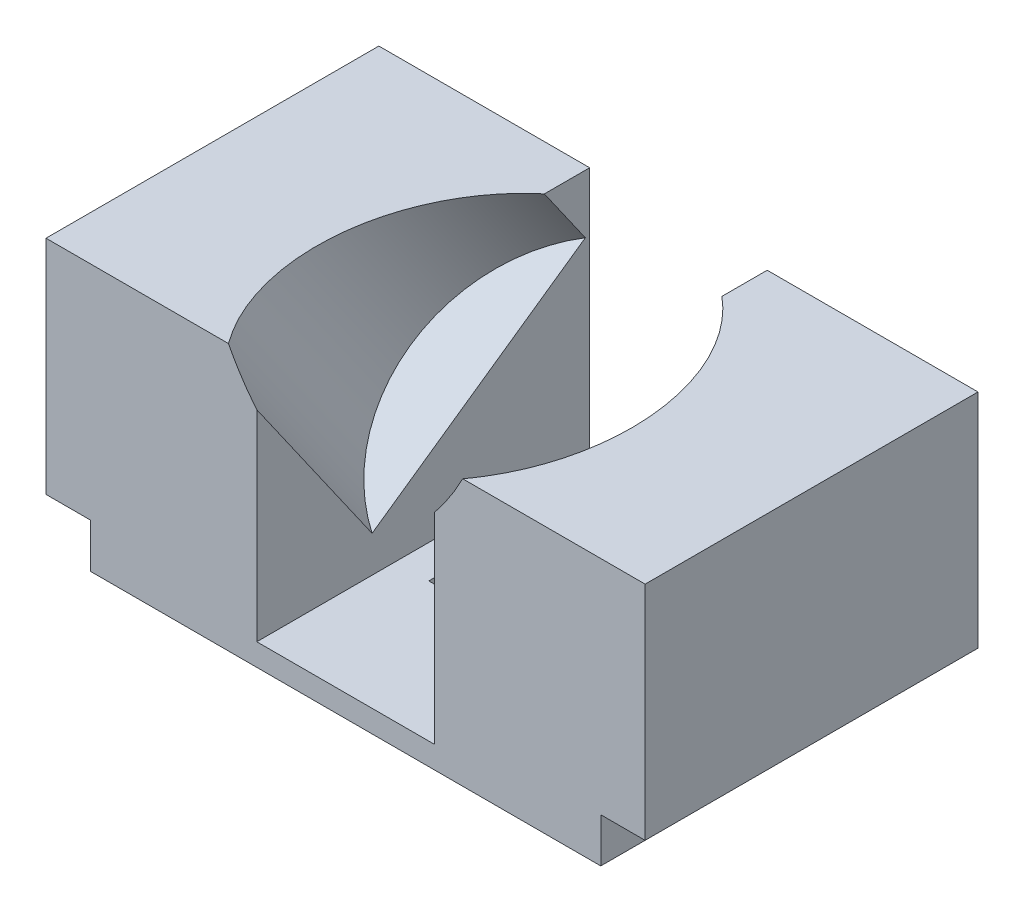
ISO-10303-21;
HEADER;
FILE_DESCRIPTION(('STEP AP214'),'2;1');
FILE_NAME('part.step','',(''),(''),'','','');
FILE_SCHEMA(('AUTOMOTIVE_DESIGN { 1 0 10303 214 1 1 1 1 }'));
ENDSEC;
DATA;
#1=APPLICATION_CONTEXT('core data for automotive mechanical design processes');
#2=APPLICATION_PROTOCOL_DEFINITION('international standard','automotive_design',2000,#1);
#3=PRODUCT_CONTEXT('',#1,'mechanical');
#4=PRODUCT('Part','Part','',(#3));
#5=PRODUCT_RELATED_PRODUCT_CATEGORY('part','',(#4));
#6=PRODUCT_DEFINITION_FORMATION('','',#4);
#7=PRODUCT_DEFINITION_CONTEXT('part definition',#1,'design');
#8=PRODUCT_DEFINITION('design','',#6,#7);
#9=PRODUCT_DEFINITION_SHAPE('','',#8);
#10=(LENGTH_UNIT() NAMED_UNIT(*) SI_UNIT(.MILLI.,.METRE.));
#11=(NAMED_UNIT(*) PLANE_ANGLE_UNIT() SI_UNIT($,.RADIAN.));
#12=(NAMED_UNIT(*) SI_UNIT($,.STERADIAN.) SOLID_ANGLE_UNIT());
#13=UNCERTAINTY_MEASURE_WITH_UNIT(LENGTH_MEASURE(1.E-05),#10,'distance_accuracy_value','');
#14=(GEOMETRIC_REPRESENTATION_CONTEXT(3) GLOBAL_UNCERTAINTY_ASSIGNED_CONTEXT((#13)) GLOBAL_UNIT_ASSIGNED_CONTEXT((#10,
#11,#12)) REPRESENTATION_CONTEXT('',''));
#15=CARTESIAN_POINT('',(0.,0.,0.));
#16=DIRECTION('',(0.,0.,1.));
#17=DIRECTION('',(1.,0.,0.));
#18=AXIS2_PLACEMENT_3D('',#15,#16,#17);
#19=CARTESIAN_POINT('',(34.29,15.24,25.4));
#20=DIRECTION('',(0.,-1.,0.));
#21=DIRECTION('',(0.,0.,-1.));
#22=AXIS2_PLACEMENT_3D('',#19,#20,#21);
#23=PLANE('',#22);
#24=DIRECTION('',(0.,0.,1.));
#25=VECTOR('',#24,1.);
#26=CARTESIAN_POINT('',(-10.16,15.24,-25.4));
#27=LINE('',#26,#25);
#28=CARTESIAN_POINT('',(-10.16,15.24,-12.7));
#29=VERTEX_POINT('',#28);
#30=CARTESIAN_POINT('',(-10.16,15.24,-7.51795064057349));
#31=VERTEX_POINT('',#30);
#32=EDGE_CURVE('E262',#29,#31,#27,.T.);
#33=ORIENTED_EDGE('',*,*,#32,.F.);
#34=DIRECTION('',(1.,0.,0.));
#35=VECTOR('',#34,1.);
#36=CARTESIAN_POINT('',(-34.29,15.24,-12.7));
#37=LINE('',#36,#35);
#38=CARTESIAN_POINT('',(-34.29,15.24,-12.7));
#39=VERTEX_POINT('',#38);
#40=EDGE_CURVE('E302',#39,#29,#37,.T.);
#41=ORIENTED_EDGE('',*,*,#40,.F.);
#42=DIRECTION('',(0.,0.,1.));
#43=VECTOR('',#42,1.);
#44=CARTESIAN_POINT('',(-34.29,15.24,25.4));
#45=LINE('',#44,#43);
#46=CARTESIAN_POINT('',(-34.29,15.24,25.4));
#47=VERTEX_POINT('',#46);
#48=EDGE_CURVE('E286',#39,#47,#45,.T.);
#49=ORIENTED_EDGE('',*,*,#48,.T.);
#50=DIRECTION('',(-1.,0.,0.));
#51=VECTOR('',#50,1.);
#52=CARTESIAN_POINT('',(34.29,15.24,25.4));
#53=LINE('',#52,#51);
#54=CARTESIAN_POINT('',(-13.4036242010132,15.24,25.4));
#55=VERTEX_POINT('',#54);
#56=EDGE_CURVE('E194',#55,#47,#53,.T.);
#57=ORIENTED_EDGE('',*,*,#56,.F.);
#58=CARTESIAN_POINT('',(0.,15.24,10.671162882316));
#59=DIRECTION('',(0.,-1.,0.));
#60=DIRECTION('',(0.,0.,-1.));
#61=AXIS2_PLACEMENT_3D('',#58,#59,#60);
#62=ELLIPSE('',#61,22.0154489337241,18.034);
#63=EDGE_CURVE('E282',#31,#55,#62,.F.);
#64=ORIENTED_EDGE('',*,*,#63,.F.);
#65=EDGE_LOOP('',(#33,#41,#49,#57,#64));
#66=FACE_BOUND('',#65,.T.);
#67=ADVANCED_FACE('F33',(#66),#23,.F.);
#68=CARTESIAN_POINT('',(0.,22.1602897761226,15.5168019501527));
#69=DIRECTION('',(0.,-0.819152044288991,-0.573576436351047));
#70=DIRECTION('',(0.,0.573576436351047,-0.819152044288991));
#71=AXIS2_PLACEMENT_3D('',#68,#69,#70);
#72=CYLINDRICAL_SURFACE('',#71,18.034);
#73=DIRECTION('',(0.,-0.819152044288991,-0.573576436351047));
#74=VECTOR('',#73,1.);
#75=CARTESIAN_POINT('',(-10.16,30.7063776541709,3.31172358167519));
#76=LINE('',#75,#74);
#77=CARTESIAN_POINT('',(-10.16,8.54608787804823,-12.2050783684775));
#78=VERTEX_POINT('',#77);
#79=EDGE_CURVE('E276',#31,#78,#76,.T.);
#80=ORIENTED_EDGE('',*,*,#79,.F.);
#81=ORIENTED_EDGE('',*,*,#63,.T.);
#82=CARTESIAN_POINT('',(0.,36.2749593712496,25.4));
#83=DIRECTION('',(0.,0.,-1.));
#84=DIRECTION('',(0.,-1.,0.));
#85=AXIS2_PLACEMENT_3D('',#82,#83,#84);
#86=ELLIPSE('',#85,31.4413195122308,18.034);
#87=CARTESIAN_POINT('',(-10.16,10.298213149129,25.4));
#88=VERTEX_POINT('',#87);
#89=EDGE_CURVE('E209',#55,#88,#86,.F.);
#90=ORIENTED_EDGE('',*,*,#89,.T.);
#91=DIRECTION('',(0.,-0.819152044288991,-0.573576436351047));
#92=VECTOR('',#91,1.);
#93=CARTESIAN_POINT('',(-10.16,13.6142018980744,27.7218803186302));
#94=LINE('',#93,#92);
#95=CARTESIAN_POINT('',(-10.16,-8.54608787804823,12.2050783684775));
#96=VERTEX_POINT('',#95);
#97=EDGE_CURVE('E274',#96,#88,#94,.F.);
#98=ORIENTED_EDGE('',*,*,#97,.F.);
#99=CARTESIAN_POINT('',(0.,0.,0.));
#100=DIRECTION('',(0.,0.819152044288991,0.573576436351047));
#101=DIRECTION('',(0.,-0.573576436351047,0.819152044288991));
#102=AXIS2_PLACEMENT_3D('',#99,#100,#101);
#103=CIRCLE('',#102,18.034);
#104=EDGE_CURVE('E278',#78,#96,#103,.T.);
#105=ORIENTED_EDGE('',*,*,#104,.F.);
#106=EDGE_LOOP('',(#80,#81,#90,#98,#105));
#107=FACE_BOUND('',#106,.T.);
#108=ADVANCED_FACE('F358',(#107),#72,.F.);
#109=CARTESIAN_POINT('',(0.,0.,0.));
#110=DIRECTION('',(0.,0.819152044288991,0.573576436351047));
#111=DIRECTION('',(0.,-0.573576436351047,0.819152044288991));
#112=AXIS2_PLACEMENT_3D('',#109,#110,#111);
#113=PLANE('',#112);
#114=DIRECTION('',(0.,-0.573576436351047,0.819152044288991));
#115=VECTOR('',#114,1.);
#116=CARTESIAN_POINT('',(-10.16,0.,0.));
#117=LINE('',#116,#115);
#118=EDGE_CURVE('E214',#78,#96,#117,.T.);
#119=ORIENTED_EDGE('',*,*,#118,.F.);
#120=ORIENTED_EDGE('',*,*,#104,.T.);
#121=EDGE_LOOP('',(#119,#120));
#122=FACE_BOUND('',#121,.T.);
#123=ADVANCED_FACE('F362',(#122),#113,.T.);
#124=DIRECTION('',(0.,0.,1.));
#125=VECTOR('',#124,1.);
#126=CARTESIAN_POINT('',(34.29,15.24,25.4));
#127=LINE('',#126,#125);
#128=CARTESIAN_POINT('',(34.29,15.24,-12.7));
#129=VERTEX_POINT('',#128);
#130=CARTESIAN_POINT('',(34.29,15.24,25.4));
#131=VERTEX_POINT('',#130);
#132=EDGE_CURVE('E201',#129,#131,#127,.T.);
#133=ORIENTED_EDGE('',*,*,#132,.F.);
#134=CARTESIAN_POINT('',(10.16,15.24,-12.7));
#135=VERTEX_POINT('',#134);
#136=EDGE_CURVE('E299',#135,#129,#37,.T.);
#137=ORIENTED_EDGE('',*,*,#136,.F.);
#138=DIRECTION('',(0.,0.,1.));
#139=VECTOR('',#138,1.);
#140=CARTESIAN_POINT('',(10.16,15.24,-25.4));
#141=LINE('',#140,#139);
#142=CARTESIAN_POINT('',(10.16,15.24,-7.51795064057348));
#143=VERTEX_POINT('',#142);
#144=EDGE_CURVE('E265',#135,#143,#141,.T.);
#145=ORIENTED_EDGE('',*,*,#144,.T.);
#146=CARTESIAN_POINT('',(13.4036242010132,15.24,25.4));
#147=VERTEX_POINT('',#146);
#148=EDGE_CURVE('E283',#147,#143,#62,.F.);
#149=ORIENTED_EDGE('',*,*,#148,.F.);
#150=EDGE_CURVE('E198',#131,#147,#53,.T.);
#151=ORIENTED_EDGE('',*,*,#150,.F.);
#152=EDGE_LOOP('',(#133,#137,#145,#149,#151));
#153=FACE_BOUND('',#152,.T.);
#154=ADVANCED_FACE('F35',(#153),#23,.F.);
#155=CARTESIAN_POINT('',(34.29,15.24,25.4));
#156=DIRECTION('',(0.,0.,-1.));
#157=DIRECTION('',(-1.,0.,0.));
#158=AXIS2_PLACEMENT_3D('',#155,#156,#157);
#159=PLANE('',#158);
#160=DIRECTION('',(0.,-1.,0.));
#161=VECTOR('',#160,1.);
#162=CARTESIAN_POINT('',(-34.29,15.24,25.4));
#163=LINE('',#162,#161);
#164=CARTESIAN_POINT('',(-34.29,-10.16,25.4));
#165=VERTEX_POINT('',#164);
#166=EDGE_CURVE('E204',#47,#165,#163,.T.);
#167=ORIENTED_EDGE('',*,*,#166,.T.);
#168=DIRECTION('',(-1.,0.,0.));
#169=VECTOR('',#168,1.);
#170=CARTESIAN_POINT('',(-34.29,-10.16,25.4));
#171=LINE('',#170,#169);
#172=CARTESIAN_POINT('',(-29.21,-10.16,25.4));
#173=VERTEX_POINT('',#172);
#174=EDGE_CURVE('E189',#173,#165,#171,.T.);
#175=ORIENTED_EDGE('',*,*,#174,.F.);
#176=DIRECTION('',(0.,1.,0.));
#177=VECTOR('',#176,1.);
#178=CARTESIAN_POINT('',(-29.21,-15.24,25.4));
#179=LINE('',#178,#177);
#180=CARTESIAN_POINT('',(-29.21,-15.24,25.4));
#181=VERTEX_POINT('',#180);
#182=EDGE_CURVE('E173',#181,#173,#179,.T.);
#183=ORIENTED_EDGE('',*,*,#182,.F.);
#184=DIRECTION('',(-1.,0.,0.));
#185=VECTOR('',#184,1.);
#186=CARTESIAN_POINT('',(34.29,-15.24,25.4));
#187=LINE('',#186,#185);
#188=CARTESIAN_POINT('',(29.21,-15.24,25.4));
#189=VERTEX_POINT('',#188);
#190=EDGE_CURVE('E188',#189,#181,#187,.T.);
#191=ORIENTED_EDGE('',*,*,#190,.F.);
#192=DIRECTION('',(0.,-1.,0.));
#193=VECTOR('',#192,1.);
#194=CARTESIAN_POINT('',(29.21,-15.24,25.4));
#195=LINE('',#194,#193);
#196=CARTESIAN_POINT('',(29.21,-10.16,25.4));
#197=VERTEX_POINT('',#196);
#198=EDGE_CURVE('E311',#197,#189,#195,.T.);
#199=ORIENTED_EDGE('',*,*,#198,.F.);
#200=DIRECTION('',(-1.,0.,0.));
#201=VECTOR('',#200,1.);
#202=CARTESIAN_POINT('',(34.29,-10.16,25.4));
#203=LINE('',#202,#201);
#204=CARTESIAN_POINT('',(34.29,-10.16,25.4));
#205=VERTEX_POINT('',#204);
#206=EDGE_CURVE('E308',#205,#197,#203,.T.);
#207=ORIENTED_EDGE('',*,*,#206,.F.);
#208=DIRECTION('',(0.,-1.,0.));
#209=VECTOR('',#208,1.);
#210=CARTESIAN_POINT('',(34.29,15.24,25.4));
#211=LINE('',#210,#209);
#212=EDGE_CURVE('E195',#131,#205,#211,.T.);
#213=ORIENTED_EDGE('',*,*,#212,.F.);
#214=ORIENTED_EDGE('',*,*,#150,.T.);
#215=CARTESIAN_POINT('',(10.16,10.298213149129,25.4));
#216=VERTEX_POINT('',#215);
#217=EDGE_CURVE('E208',#216,#147,#86,.F.);
#218=ORIENTED_EDGE('',*,*,#217,.F.);
#219=DIRECTION('',(0.,1.,0.));
#220=VECTOR('',#219,1.);
#221=CARTESIAN_POINT('',(10.16,-12.7,25.4));
#222=LINE('',#221,#220);
#223=CARTESIAN_POINT('',(10.16,-12.7,25.4));
#224=VERTEX_POINT('',#223);
#225=EDGE_CURVE('E259',#224,#216,#222,.T.);
#226=ORIENTED_EDGE('',*,*,#225,.F.);
#227=DIRECTION('',(1.,0.,0.));
#228=VECTOR('',#227,1.);
#229=CARTESIAN_POINT('',(-10.16,-12.7,25.4));
#230=LINE('',#229,#228);
#231=CARTESIAN_POINT('',(-10.16,-12.7,25.4));
#232=VERTEX_POINT('',#231);
#233=EDGE_CURVE('E245',#232,#224,#230,.T.);
#234=ORIENTED_EDGE('',*,*,#233,.F.);
#235=DIRECTION('',(0.,-1.,0.));
#236=VECTOR('',#235,1.);
#237=CARTESIAN_POINT('',(-10.16,-12.7,25.4));
#238=LINE('',#237,#236);
#239=EDGE_CURVE('E241',#88,#232,#238,.T.);
#240=ORIENTED_EDGE('',*,*,#239,.F.);
#241=ORIENTED_EDGE('',*,*,#89,.F.);
#242=ORIENTED_EDGE('',*,*,#56,.T.);
#243=EDGE_LOOP('',(#167,#175,#183,#191,#199,#207,#213,#214,#218,#226,#234,#240,#241,#242));
#244=FACE_BOUND('',#243,.T.);
#245=ADVANCED_FACE('F186',(#244),#159,.F.);
#246=CARTESIAN_POINT('',(34.29,-15.24,25.4));
#247=DIRECTION('',(0.,1.,0.));
#248=DIRECTION('',(0.,0.,1.));
#249=AXIS2_PLACEMENT_3D('',#246,#247,#248);
#250=PLANE('',#249);
#251=DIRECTION('',(-1.,0.,0.));
#252=VECTOR('',#251,1.);
#253=CARTESIAN_POINT('',(6.35,-15.24,-9.52500000000001));
#254=LINE('',#253,#252);
#255=CARTESIAN_POINT('',(6.35,-15.24,-9.52500000000001));
#256=VERTEX_POINT('',#255);
#257=CARTESIAN_POINT('',(-6.35,-15.24,-9.525));
#258=VERTEX_POINT('',#257);
#259=EDGE_CURVE('E251',#256,#258,#254,.T.);
#260=ORIENTED_EDGE('',*,*,#259,.T.);
#261=DIRECTION('',(0.,0.,1.));
#262=VECTOR('',#261,1.);
#263=CARTESIAN_POINT('',(-6.35,-15.24,-9.525));
#264=LINE('',#263,#262);
#265=CARTESIAN_POINT('',(-6.34999999999999,-15.24,9.525));
#266=VERTEX_POINT('',#265);
#267=EDGE_CURVE('E237',#258,#266,#264,.T.);
#268=ORIENTED_EDGE('',*,*,#267,.T.);
#269=DIRECTION('',(1.,0.,0.));
#270=VECTOR('',#269,1.);
#271=CARTESIAN_POINT('',(6.35000000000001,-15.24,9.525));
#272=LINE('',#271,#270);
#273=CARTESIAN_POINT('',(6.35,-15.24,9.525));
#274=VERTEX_POINT('',#273);
#275=EDGE_CURVE('E334',#266,#274,#272,.T.);
#276=ORIENTED_EDGE('',*,*,#275,.T.);
#277=DIRECTION('',(0.,0.,-1.));
#278=VECTOR('',#277,1.);
#279=CARTESIAN_POINT('',(6.35,-15.24,-9.52500000000001));
#280=LINE('',#279,#278);
#281=EDGE_CURVE('E336',#274,#256,#280,.T.);
#282=ORIENTED_EDGE('',*,*,#281,.T.);
#283=EDGE_LOOP('',(#260,#268,#276,#282));
#284=FACE_BOUND('',#283,.T.);
#285=ORIENTED_EDGE('',*,*,#190,.T.);
#286=DIRECTION('',(0.,0.,1.));
#287=VECTOR('',#286,1.);
#288=CARTESIAN_POINT('',(-29.21,-15.24,-12.7));
#289=LINE('',#288,#287);
#290=CARTESIAN_POINT('',(-29.21,-15.24,-12.7));
#291=VERTEX_POINT('',#290);
#292=EDGE_CURVE('E170',#291,#181,#289,.T.);
#293=ORIENTED_EDGE('',*,*,#292,.F.);
#294=DIRECTION('',(1.,0.,0.));
#295=VECTOR('',#294,1.);
#296=CARTESIAN_POINT('',(-34.29,-15.24,-12.7));
#297=LINE('',#296,#295);
#298=CARTESIAN_POINT('',(29.21,-15.24,-12.7));
#299=VERTEX_POINT('',#298);
#300=EDGE_CURVE('E322',#291,#299,#297,.T.);
#301=ORIENTED_EDGE('',*,*,#300,.T.);
#302=DIRECTION('',(0.,0.,1.));
#303=VECTOR('',#302,1.);
#304=CARTESIAN_POINT('',(29.21,-15.24,-12.7));
#305=LINE('',#304,#303);
#306=EDGE_CURVE('E190',#299,#189,#305,.T.);
#307=ORIENTED_EDGE('',*,*,#306,.T.);
#308=EDGE_LOOP('',(#285,#293,#301,#307));
#309=FACE_BOUND('',#308,.T.);
#310=ADVANCED_FACE('F193',(#284,#309),#250,.F.);
#311=CARTESIAN_POINT('',(34.29,0.,0.));
#312=DIRECTION('',(1.,0.,0.));
#313=DIRECTION('',(0.,0.,-1.));
#314=AXIS2_PLACEMENT_3D('',#311,#312,#313);
#315=PLANE('',#314);
#316=DIRECTION('',(0.,0.,1.));
#317=VECTOR('',#316,1.);
#318=CARTESIAN_POINT('',(34.29,-10.16,-12.7));
#319=LINE('',#318,#317);
#320=CARTESIAN_POINT('',(34.29,-10.16,-12.7));
#321=VERTEX_POINT('',#320);
#322=EDGE_CURVE('E317',#321,#205,#319,.T.);
#323=ORIENTED_EDGE('',*,*,#322,.F.);
#324=DIRECTION('',(0.,1.,0.));
#325=VECTOR('',#324,1.);
#326=CARTESIAN_POINT('',(34.29,-15.24,-12.7));
#327=LINE('',#326,#325);
#328=EDGE_CURVE('E324',#321,#129,#327,.T.);
#329=ORIENTED_EDGE('',*,*,#328,.T.);
#330=ORIENTED_EDGE('',*,*,#132,.T.);
#331=ORIENTED_EDGE('',*,*,#212,.T.);
#332=EDGE_LOOP('',(#323,#329,#330,#331));
#333=FACE_BOUND('',#332,.T.);
#334=ADVANCED_FACE('F384',(#333),#315,.T.);
#335=CARTESIAN_POINT('',(-34.29,0.,0.));
#336=DIRECTION('',(1.,0.,0.));
#337=DIRECTION('',(0.,0.,-1.));
#338=AXIS2_PLACEMENT_3D('',#335,#336,#337);
#339=PLANE('',#338);
#340=DIRECTION('',(0.,1.,0.));
#341=VECTOR('',#340,1.);
#342=CARTESIAN_POINT('',(-34.29,-15.24,-12.7));
#343=LINE('',#342,#341);
#344=CARTESIAN_POINT('',(-34.29,-10.16,-12.7));
#345=VERTEX_POINT('',#344);
#346=EDGE_CURVE('E298',#345,#39,#343,.T.);
#347=ORIENTED_EDGE('',*,*,#346,.F.);
#348=DIRECTION('',(0.,0.,1.));
#349=VECTOR('',#348,1.);
#350=CARTESIAN_POINT('',(-34.29,-10.16,-12.7));
#351=LINE('',#350,#349);
#352=EDGE_CURVE('E297',#345,#165,#351,.T.);
#353=ORIENTED_EDGE('',*,*,#352,.T.);
#354=ORIENTED_EDGE('',*,*,#166,.F.);
#355=ORIENTED_EDGE('',*,*,#48,.F.);
#356=EDGE_LOOP('',(#347,#353,#354,#355));
#357=FACE_BOUND('',#356,.T.);
#358=ADVANCED_FACE('F296',(#357),#339,.F.);
#359=DIRECTION('',(0.,-0.819152044288991,-0.573576436351047));
#360=VECTOR('',#359,1.);
#361=CARTESIAN_POINT('',(10.16,13.6142018980744,27.7218803186302));
#362=LINE('',#361,#360);
#363=CARTESIAN_POINT('',(10.16,-8.54608787804823,12.2050783684775));
#364=VERTEX_POINT('',#363);
#365=EDGE_CURVE('E272',#216,#364,#362,.T.);
#366=ORIENTED_EDGE('',*,*,#365,.F.);
#367=ORIENTED_EDGE('',*,*,#217,.T.);
#368=ORIENTED_EDGE('',*,*,#148,.T.);
#369=DIRECTION('',(0.,-0.819152044288991,-0.573576436351047));
#370=VECTOR('',#369,1.);
#371=CARTESIAN_POINT('',(10.16,30.7063776541709,3.31172358167519));
#372=LINE('',#371,#370);
#373=CARTESIAN_POINT('',(10.16,8.54608787804823,-12.2050783684775));
#374=VERTEX_POINT('',#373);
#375=EDGE_CURVE('E264',#374,#143,#372,.F.);
#376=ORIENTED_EDGE('',*,*,#375,.F.);
#377=EDGE_CURVE('E279',#364,#374,#103,.T.);
#378=ORIENTED_EDGE('',*,*,#377,.F.);
#379=EDGE_LOOP('',(#366,#367,#368,#376,#378));
#380=FACE_BOUND('',#379,.T.);
#381=ADVANCED_FACE('F365',(#380),#72,.F.);
#382=DIRECTION('',(0.,0.573576436351047,-0.819152044288991));
#383=VECTOR('',#382,1.);
#384=CARTESIAN_POINT('',(10.16,0.,0.));
#385=LINE('',#384,#383);
#386=EDGE_CURVE('E212',#364,#374,#385,.T.);
#387=ORIENTED_EDGE('',*,*,#386,.F.);
#388=ORIENTED_EDGE('',*,*,#377,.T.);
#389=EDGE_LOOP('',(#387,#388));
#390=FACE_BOUND('',#389,.T.);
#391=ADVANCED_FACE('F375',(#390),#113,.T.);
#392=CARTESIAN_POINT('',(-10.16,-12.7,-25.4));
#393=DIRECTION('',(-1.,0.,0.));
#394=DIRECTION('',(0.,0.,1.));
#395=AXIS2_PLACEMENT_3D('',#392,#393,#394);
#396=PLANE('',#395);
#397=DIRECTION('',(0.,0.,1.));
#398=VECTOR('',#397,1.);
#399=CARTESIAN_POINT('',(-10.16,-12.7,-25.4));
#400=LINE('',#399,#398);
#401=CARTESIAN_POINT('',(-10.16,-12.7,-12.7));
#402=VERTEX_POINT('',#401);
#403=EDGE_CURVE('E261',#402,#232,#400,.T.);
#404=ORIENTED_EDGE('',*,*,#403,.F.);
#405=DIRECTION('',(0.,1.,0.));
#406=VECTOR('',#405,1.);
#407=CARTESIAN_POINT('',(-10.16,-12.7,-12.7));
#408=LINE('',#407,#406);
#409=EDGE_CURVE('E330',#402,#29,#408,.T.);
#410=ORIENTED_EDGE('',*,*,#409,.T.);
#411=ORIENTED_EDGE('',*,*,#32,.T.);
#412=ORIENTED_EDGE('',*,*,#79,.T.);
#413=ORIENTED_EDGE('',*,*,#118,.T.);
#414=ORIENTED_EDGE('',*,*,#97,.T.);
#415=ORIENTED_EDGE('',*,*,#239,.T.);
#416=EDGE_LOOP('',(#404,#410,#411,#412,#413,#414,#415));
#417=FACE_BOUND('',#416,.T.);
#418=ADVANCED_FACE('F426',(#417),#396,.F.);
#419=CARTESIAN_POINT('',(10.16,-12.7,-25.4));
#420=DIRECTION('',(1.,0.,0.));
#421=DIRECTION('',(0.,0.,-1.));
#422=AXIS2_PLACEMENT_3D('',#419,#420,#421);
#423=PLANE('',#422);
#424=ORIENTED_EDGE('',*,*,#144,.F.);
#425=DIRECTION('',(0.,-1.,0.));
#426=VECTOR('',#425,1.);
#427=CARTESIAN_POINT('',(10.16,-12.7,-12.7));
#428=LINE('',#427,#426);
#429=CARTESIAN_POINT('',(10.16,-12.7,-12.7));
#430=VERTEX_POINT('',#429);
#431=EDGE_CURVE('E326',#135,#430,#428,.T.);
#432=ORIENTED_EDGE('',*,*,#431,.T.);
#433=DIRECTION('',(0.,0.,1.));
#434=VECTOR('',#433,1.);
#435=CARTESIAN_POINT('',(10.16,-12.7,-25.4));
#436=LINE('',#435,#434);
#437=EDGE_CURVE('E267',#430,#224,#436,.T.);
#438=ORIENTED_EDGE('',*,*,#437,.T.);
#439=ORIENTED_EDGE('',*,*,#225,.T.);
#440=ORIENTED_EDGE('',*,*,#365,.T.);
#441=ORIENTED_EDGE('',*,*,#386,.T.);
#442=ORIENTED_EDGE('',*,*,#375,.T.);
#443=EDGE_LOOP('',(#424,#432,#438,#439,#440,#441,#442));
#444=FACE_BOUND('',#443,.T.);
#445=ADVANCED_FACE('F388',(#444),#423,.F.);
#446=CARTESIAN_POINT('',(-10.16,-12.7,-25.4));
#447=DIRECTION('',(0.,-1.,0.));
#448=DIRECTION('',(0.,0.,-1.));
#449=AXIS2_PLACEMENT_3D('',#446,#447,#448);
#450=PLANE('',#449);
#451=DIRECTION('',(-1.,0.,0.));
#452=VECTOR('',#451,1.);
#453=CARTESIAN_POINT('',(-10.16,-12.7,9.525));
#454=LINE('',#453,#452);
#455=CARTESIAN_POINT('',(6.35000000000001,-12.7,9.525));
#456=VERTEX_POINT('',#455);
#457=CARTESIAN_POINT('',(-6.34999999999999,-12.7,9.525));
#458=VERTEX_POINT('',#457);
#459=EDGE_CURVE('E216',#456,#458,#454,.T.);
#460=ORIENTED_EDGE('',*,*,#459,.T.);
#461=DIRECTION('',(0.,0.,-1.));
#462=VECTOR('',#461,1.);
#463=CARTESIAN_POINT('',(-6.35,-12.7,-25.4));
#464=LINE('',#463,#462);
#465=CARTESIAN_POINT('',(-6.35,-12.7,-9.525));
#466=VERTEX_POINT('',#465);
#467=EDGE_CURVE('E41',#458,#466,#464,.T.);
#468=ORIENTED_EDGE('',*,*,#467,.T.);
#469=DIRECTION('',(1.,0.,0.));
#470=VECTOR('',#469,1.);
#471=CARTESIAN_POINT('',(-10.16,-12.7,-9.525));
#472=LINE('',#471,#470);
#473=CARTESIAN_POINT('',(6.35,-12.7,-9.52500000000001));
#474=VERTEX_POINT('',#473);
#475=EDGE_CURVE('E222',#466,#474,#472,.T.);
#476=ORIENTED_EDGE('',*,*,#475,.T.);
#477=DIRECTION('',(0.,0.,1.));
#478=VECTOR('',#477,1.);
#479=CARTESIAN_POINT('',(6.35,-12.7,-25.4));
#480=LINE('',#479,#478);
#481=EDGE_CURVE('E219',#474,#456,#480,.T.);
#482=ORIENTED_EDGE('',*,*,#481,.T.);
#483=EDGE_LOOP('',(#460,#468,#476,#482));
#484=FACE_BOUND('',#483,.T.);
#485=ORIENTED_EDGE('',*,*,#437,.F.);
#486=DIRECTION('',(-1.,0.,0.));
#487=VECTOR('',#486,1.);
#488=CARTESIAN_POINT('',(-10.16,-12.7,-12.7));
#489=LINE('',#488,#487);
#490=EDGE_CURVE('E11',#430,#402,#489,.T.);
#491=ORIENTED_EDGE('',*,*,#490,.T.);
#492=ORIENTED_EDGE('',*,*,#403,.T.);
#493=ORIENTED_EDGE('',*,*,#233,.T.);
#494=EDGE_LOOP('',(#485,#491,#492,#493));
#495=FACE_BOUND('',#494,.T.);
#496=ADVANCED_FACE('F227',(#484,#495),#450,.F.);
#497=CARTESIAN_POINT('',(-6.35,-15.24,-9.525));
#498=DIRECTION('',(-1.,0.,0.));
#499=DIRECTION('',(0.,0.,1.));
#500=AXIS2_PLACEMENT_3D('',#497,#498,#499);
#501=PLANE('',#500);
#502=DIRECTION('',(0.,1.,0.));
#503=VECTOR('',#502,1.);
#504=CARTESIAN_POINT('',(-6.34999999999999,-15.24,9.525));
#505=LINE('',#504,#503);
#506=EDGE_CURVE('E233',#266,#458,#505,.T.);
#507=ORIENTED_EDGE('',*,*,#506,.F.);
#508=ORIENTED_EDGE('',*,*,#267,.F.);
#509=DIRECTION('',(0.,1.,0.));
#510=VECTOR('',#509,1.);
#511=CARTESIAN_POINT('',(-6.35,-15.24,-9.525));
#512=LINE('',#511,#510);
#513=EDGE_CURVE('E235',#258,#466,#512,.T.);
#514=ORIENTED_EDGE('',*,*,#513,.T.);
#515=ORIENTED_EDGE('',*,*,#467,.F.);
#516=EDGE_LOOP('',(#507,#508,#514,#515));
#517=FACE_BOUND('',#516,.T.);
#518=ADVANCED_FACE('F231',(#517),#501,.F.);
#519=CARTESIAN_POINT('',(6.35,-15.24,-9.52500000000001));
#520=DIRECTION('',(0.,0.,-1.));
#521=DIRECTION('',(-1.,0.,0.));
#522=AXIS2_PLACEMENT_3D('',#519,#520,#521);
#523=PLANE('',#522);
#524=ORIENTED_EDGE('',*,*,#513,.F.);
#525=ORIENTED_EDGE('',*,*,#259,.F.);
#526=DIRECTION('',(0.,1.,0.));
#527=VECTOR('',#526,1.);
#528=CARTESIAN_POINT('',(6.35,-15.24,-9.52500000000001));
#529=LINE('',#528,#527);
#530=EDGE_CURVE('E242',#256,#474,#529,.T.);
#531=ORIENTED_EDGE('',*,*,#530,.T.);
#532=ORIENTED_EDGE('',*,*,#475,.F.);
#533=EDGE_LOOP('',(#524,#525,#531,#532));
#534=FACE_BOUND('',#533,.T.);
#535=ADVANCED_FACE('F339',(#534),#523,.F.);
#536=CARTESIAN_POINT('',(6.35,-15.24,-9.52500000000001));
#537=DIRECTION('',(1.,0.,0.));
#538=DIRECTION('',(0.,0.,-1.));
#539=AXIS2_PLACEMENT_3D('',#536,#537,#538);
#540=PLANE('',#539);
#541=ORIENTED_EDGE('',*,*,#530,.F.);
#542=ORIENTED_EDGE('',*,*,#281,.F.);
#543=DIRECTION('',(0.,1.,0.));
#544=VECTOR('',#543,1.);
#545=CARTESIAN_POINT('',(6.35000000000001,-15.24,9.525));
#546=LINE('',#545,#544);
#547=EDGE_CURVE('E248',#274,#456,#546,.T.);
#548=ORIENTED_EDGE('',*,*,#547,.T.);
#549=ORIENTED_EDGE('',*,*,#481,.F.);
#550=EDGE_LOOP('',(#541,#542,#548,#549));
#551=FACE_BOUND('',#550,.T.);
#552=ADVANCED_FACE('F341',(#551),#540,.F.);
#553=CARTESIAN_POINT('',(6.35000000000001,-15.24,9.525));
#554=DIRECTION('',(0.,0.,1.));
#555=DIRECTION('',(1.,0.,0.));
#556=AXIS2_PLACEMENT_3D('',#553,#554,#555);
#557=PLANE('',#556);
#558=ORIENTED_EDGE('',*,*,#547,.F.);
#559=ORIENTED_EDGE('',*,*,#275,.F.);
#560=ORIENTED_EDGE('',*,*,#506,.T.);
#561=ORIENTED_EDGE('',*,*,#459,.F.);
#562=EDGE_LOOP('',(#558,#559,#560,#561));
#563=FACE_BOUND('',#562,.T.);
#564=ADVANCED_FACE('F344',(#563),#557,.F.);
#565=CARTESIAN_POINT('',(-34.29,-15.24,-12.7));
#566=DIRECTION('',(0.,0.,1.));
#567=DIRECTION('',(1.,0.,0.));
#568=AXIS2_PLACEMENT_3D('',#565,#566,#567);
#569=PLANE('',#568);
#570=DIRECTION('',(0.,1.,0.));
#571=VECTOR('',#570,1.);
#572=CARTESIAN_POINT('',(-29.21,-15.24,-12.7));
#573=LINE('',#572,#571);
#574=CARTESIAN_POINT('',(-29.21,-10.16,-12.7));
#575=VERTEX_POINT('',#574);
#576=EDGE_CURVE('E176',#291,#575,#573,.T.);
#577=ORIENTED_EDGE('',*,*,#576,.T.);
#578=DIRECTION('',(-1.,0.,0.));
#579=VECTOR('',#578,1.);
#580=CARTESIAN_POINT('',(-34.29,-10.16,-12.7));
#581=LINE('',#580,#579);
#582=EDGE_CURVE('E48',#575,#345,#581,.T.);
#583=ORIENTED_EDGE('',*,*,#582,.T.);
#584=ORIENTED_EDGE('',*,*,#346,.T.);
#585=ORIENTED_EDGE('',*,*,#40,.T.);
#586=ORIENTED_EDGE('',*,*,#409,.F.);
#587=ORIENTED_EDGE('',*,*,#490,.F.);
#588=ORIENTED_EDGE('',*,*,#431,.F.);
#589=ORIENTED_EDGE('',*,*,#136,.T.);
#590=ORIENTED_EDGE('',*,*,#328,.F.);
#591=DIRECTION('',(-1.,0.,0.));
#592=VECTOR('',#591,1.);
#593=CARTESIAN_POINT('',(34.29,-10.16,-12.7));
#594=LINE('',#593,#592);
#595=CARTESIAN_POINT('',(29.21,-10.16,-12.7));
#596=VERTEX_POINT('',#595);
#597=EDGE_CURVE('E313',#321,#596,#594,.T.);
#598=ORIENTED_EDGE('',*,*,#597,.T.);
#599=DIRECTION('',(0.,-1.,0.));
#600=VECTOR('',#599,1.);
#601=CARTESIAN_POINT('',(29.21,-15.24,-12.7));
#602=LINE('',#601,#600);
#603=EDGE_CURVE('E56',#596,#299,#602,.T.);
#604=ORIENTED_EDGE('',*,*,#603,.T.);
#605=ORIENTED_EDGE('',*,*,#300,.F.);
#606=EDGE_LOOP('',(#577,#583,#584,#585,#586,#587,#588,#589,#590,#598,#604,#605));
#607=FACE_BOUND('',#606,.T.);
#608=ADVANCED_FACE('F346',(#607),#569,.F.);
#609=CARTESIAN_POINT('',(29.21,-15.24,-12.7));
#610=DIRECTION('',(-1.,0.,0.));
#611=DIRECTION('',(0.,-1.,0.));
#612=AXIS2_PLACEMENT_3D('',#609,#610,#611);
#613=PLANE('',#612);
#614=ORIENTED_EDGE('',*,*,#306,.F.);
#615=ORIENTED_EDGE('',*,*,#603,.F.);
#616=DIRECTION('',(0.,0.,1.));
#617=VECTOR('',#616,1.);
#618=CARTESIAN_POINT('',(29.21,-10.16,-12.7));
#619=LINE('',#618,#617);
#620=EDGE_CURVE('E319',#596,#197,#619,.T.);
#621=ORIENTED_EDGE('',*,*,#620,.T.);
#622=ORIENTED_EDGE('',*,*,#198,.T.);
#623=EDGE_LOOP('',(#614,#615,#621,#622));
#624=FACE_BOUND('',#623,.T.);
#625=ADVANCED_FACE('F352',(#624),#613,.F.);
#626=CARTESIAN_POINT('',(34.29,-10.16,-12.7));
#627=DIRECTION('',(0.,1.,0.));
#628=DIRECTION('',(-1.,0.,0.));
#629=AXIS2_PLACEMENT_3D('',#626,#627,#628);
#630=PLANE('',#629);
#631=ORIENTED_EDGE('',*,*,#620,.F.);
#632=ORIENTED_EDGE('',*,*,#597,.F.);
#633=ORIENTED_EDGE('',*,*,#322,.T.);
#634=ORIENTED_EDGE('',*,*,#206,.T.);
#635=EDGE_LOOP('',(#631,#632,#633,#634));
#636=FACE_BOUND('',#635,.T.);
#637=ADVANCED_FACE('F402',(#636),#630,.F.);
#638=CARTESIAN_POINT('',(-34.29,-10.16,-12.7));
#639=DIRECTION('',(0.,1.,0.));
#640=DIRECTION('',(0.,0.,1.));
#641=AXIS2_PLACEMENT_3D('',#638,#639,#640);
#642=PLANE('',#641);
#643=ORIENTED_EDGE('',*,*,#352,.F.);
#644=ORIENTED_EDGE('',*,*,#582,.F.);
#645=DIRECTION('',(0.,0.,1.));
#646=VECTOR('',#645,1.);
#647=CARTESIAN_POINT('',(-29.21,-10.16,-12.7));
#648=LINE('',#647,#646);
#649=EDGE_CURVE('E181',#575,#173,#648,.T.);
#650=ORIENTED_EDGE('',*,*,#649,.T.);
#651=ORIENTED_EDGE('',*,*,#174,.T.);
#652=EDGE_LOOP('',(#643,#644,#650,#651));
#653=FACE_BOUND('',#652,.T.);
#654=ADVANCED_FACE('F404',(#653),#642,.F.);
#655=CARTESIAN_POINT('',(-29.21,-15.24,-12.7));
#656=DIRECTION('',(1.,0.,0.));
#657=DIRECTION('',(0.,0.,-1.));
#658=AXIS2_PLACEMENT_3D('',#655,#656,#657);
#659=PLANE('',#658);
#660=ORIENTED_EDGE('',*,*,#649,.F.);
#661=ORIENTED_EDGE('',*,*,#576,.F.);
#662=ORIENTED_EDGE('',*,*,#292,.T.);
#663=ORIENTED_EDGE('',*,*,#182,.T.);
#664=EDGE_LOOP('',(#660,#661,#662,#663));
#665=FACE_BOUND('',#664,.T.);
#666=ADVANCED_FACE('F172',(#665),#659,.F.);
#667=CLOSED_SHELL('',(#67,#108,#123,#154,#245,#310,#334,#358,#381,#391,#418,#445,#496,#518,#535,
#552,#564,#608,#625,#637,#654,#666));
#668=MANIFOLD_SOLID_BREP('B2',#667);
#669=ADVANCED_BREP_SHAPE_REPRESENTATION('',(#18,#668),#14);
#670=SHAPE_DEFINITION_REPRESENTATION(#9,#669);
ENDSEC;
END-ISO-10303-21;
